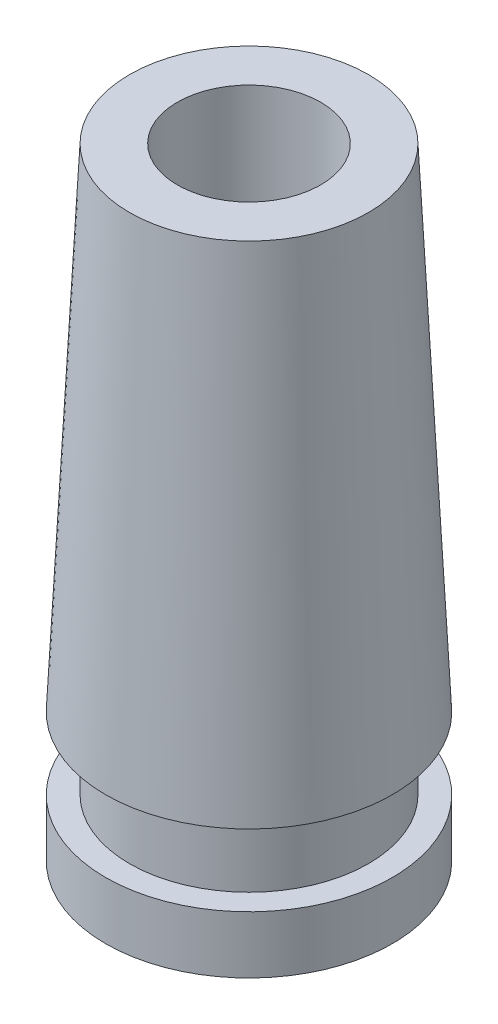
ISO-10303-21;
HEADER;
FILE_DESCRIPTION(('STEP AP214'),'2;1');
FILE_NAME('part.step','',(''),(''),'','','');
FILE_SCHEMA(('AUTOMOTIVE_DESIGN { 1 0 10303 214 1 1 1 1 }'));
ENDSEC;
DATA;
#1=APPLICATION_CONTEXT('core data for automotive mechanical design processes');
#2=APPLICATION_PROTOCOL_DEFINITION('international standard','automotive_design',2000,#1);
#3=PRODUCT_CONTEXT('',#1,'mechanical');
#4=PRODUCT('Part','Part','',(#3));
#5=PRODUCT_RELATED_PRODUCT_CATEGORY('part','',(#4));
#6=PRODUCT_DEFINITION_FORMATION('','',#4);
#7=PRODUCT_DEFINITION_CONTEXT('part definition',#1,'design');
#8=PRODUCT_DEFINITION('design','',#6,#7);
#9=PRODUCT_DEFINITION_SHAPE('','',#8);
#10=(LENGTH_UNIT() NAMED_UNIT(*) SI_UNIT(.MILLI.,.METRE.));
#11=(NAMED_UNIT(*) PLANE_ANGLE_UNIT() SI_UNIT($,.RADIAN.));
#12=(NAMED_UNIT(*) SI_UNIT($,.STERADIAN.) SOLID_ANGLE_UNIT());
#13=UNCERTAINTY_MEASURE_WITH_UNIT(LENGTH_MEASURE(1.E-05),#10,'distance_accuracy_value','');
#14=(GEOMETRIC_REPRESENTATION_CONTEXT(3) GLOBAL_UNCERTAINTY_ASSIGNED_CONTEXT((#13)) GLOBAL_UNIT_ASSIGNED_CONTEXT((#10,
#11,#12)) REPRESENTATION_CONTEXT('',''));
#15=CARTESIAN_POINT('',(0.,0.,0.));
#16=DIRECTION('',(0.,0.,1.));
#17=DIRECTION('',(1.,0.,0.));
#18=AXIS2_PLACEMENT_3D('',#15,#16,#17);
#19=CARTESIAN_POINT('',(0.,0.,0.));
#20=DIRECTION('',(0.,-1.,0.));
#21=DIRECTION('',(0.,0.,-1.));
#22=AXIS2_PLACEMENT_3D('',#19,#20,#21);
#23=CYLINDRICAL_SURFACE('',#22,3.);
#24=CARTESIAN_POINT('',(0.,0.,0.));
#25=DIRECTION('',(0.,-1.,0.));
#26=DIRECTION('',(0.,0.,-1.));
#27=AXIS2_PLACEMENT_3D('',#24,#25,#26);
#28=CIRCLE('',#27,3.);
#29=CARTESIAN_POINT('',(0.,0.,-3.));
#30=VERTEX_POINT('',#29);
#31=EDGE_CURVE('E60',#30,#30,#28,.T.);
#32=ORIENTED_EDGE('',*,*,#31,.F.);
#33=EDGE_LOOP('',(#32));
#34=FACE_BOUND('',#33,.T.);
#35=CARTESIAN_POINT('',(0.,1.2,0.));
#36=DIRECTION('',(0.,-1.,0.));
#37=DIRECTION('',(0.,0.,-1.));
#38=AXIS2_PLACEMENT_3D('',#35,#36,#37);
#39=CIRCLE('',#38,3.);
#40=CARTESIAN_POINT('',(0.,1.2,-3.));
#41=VERTEX_POINT('',#40);
#42=EDGE_CURVE('E10',#41,#41,#39,.T.);
#43=ORIENTED_EDGE('',*,*,#42,.T.);
#44=EDGE_LOOP('',(#43));
#45=FACE_BOUND('',#44,.T.);
#46=ADVANCED_FACE('F32',(#34,#45),#23,.T.);
#47=CARTESIAN_POINT('',(-3.,1.2,0.));
#48=DIRECTION('',(0.,-1.,0.));
#49=DIRECTION('',(0.,0.,-1.));
#50=AXIS2_PLACEMENT_3D('',#47,#48,#49);
#51=PLANE('',#50);
#52=ORIENTED_EDGE('',*,*,#42,.F.);
#53=EDGE_LOOP('',(#52));
#54=FACE_BOUND('',#53,.T.);
#55=CARTESIAN_POINT('',(0.,1.2,0.));
#56=DIRECTION('',(0.,-1.,0.));
#57=DIRECTION('',(0.,0.,-1.));
#58=AXIS2_PLACEMENT_3D('',#55,#56,#57);
#59=CIRCLE('',#58,2.5);
#60=CARTESIAN_POINT('',(0.,1.2,-2.5));
#61=VERTEX_POINT('',#60);
#62=EDGE_CURVE('E38',#61,#61,#59,.T.);
#63=ORIENTED_EDGE('',*,*,#62,.T.);
#64=EDGE_LOOP('',(#63));
#65=FACE_BOUND('',#64,.T.);
#66=ADVANCED_FACE('F67',(#54,#65),#51,.F.);
#67=CARTESIAN_POINT('',(0.,0.,0.));
#68=DIRECTION('',(0.,-1.,0.));
#69=DIRECTION('',(0.,0.,-1.));
#70=AXIS2_PLACEMENT_3D('',#67,#68,#69);
#71=CYLINDRICAL_SURFACE('',#70,2.5);
#72=ORIENTED_EDGE('',*,*,#62,.F.);
#73=EDGE_LOOP('',(#72));
#74=FACE_BOUND('',#73,.T.);
#75=CARTESIAN_POINT('',(0.,2.7,0.));
#76=DIRECTION('',(0.,-1.,0.));
#77=DIRECTION('',(0.,0.,-1.));
#78=AXIS2_PLACEMENT_3D('',#75,#76,#77);
#79=CIRCLE('',#78,2.5);
#80=CARTESIAN_POINT('',(0.,2.7,-2.5));
#81=VERTEX_POINT('',#80);
#82=EDGE_CURVE('E42',#81,#81,#79,.T.);
#83=ORIENTED_EDGE('',*,*,#82,.T.);
#84=EDGE_LOOP('',(#83));
#85=FACE_BOUND('',#84,.T.);
#86=ADVANCED_FACE('F71',(#74,#85),#71,.T.);
#87=CARTESIAN_POINT('',(-2.5,2.7,0.));
#88=DIRECTION('',(0.,1.,0.));
#89=DIRECTION('',(0.,0.,1.));
#90=AXIS2_PLACEMENT_3D('',#87,#88,#89);
#91=PLANE('',#90);
#92=ORIENTED_EDGE('',*,*,#82,.F.);
#93=EDGE_LOOP('',(#92));
#94=FACE_BOUND('',#93,.T.);
#95=CARTESIAN_POINT('',(0.,2.7,0.));
#96=DIRECTION('',(0.,-1.,0.));
#97=DIRECTION('',(0.,0.,-1.));
#98=AXIS2_PLACEMENT_3D('',#95,#96,#97);
#99=CIRCLE('',#98,3.);
#100=CARTESIAN_POINT('',(0.,2.7,-3.));
#101=VERTEX_POINT('',#100);
#102=EDGE_CURVE('E46',#101,#101,#99,.T.);
#103=ORIENTED_EDGE('',*,*,#102,.T.);
#104=EDGE_LOOP('',(#103));
#105=FACE_BOUND('',#104,.T.);
#106=ADVANCED_FACE('F76',(#94,#105),#91,.F.);
#107=CARTESIAN_POINT('',(0.,13.,0.));
#108=DIRECTION('',(0.,-1.,0.));
#109=DIRECTION('',(0.,0.,-1.));
#110=AXIS2_PLACEMENT_3D('',#107,#108,#109);
#111=CONICAL_SURFACE('',#110,2.5,0.0485056122403835);
#112=ORIENTED_EDGE('',*,*,#102,.F.);
#113=EDGE_LOOP('',(#112));
#114=FACE_BOUND('',#113,.T.);
#115=CARTESIAN_POINT('',(0.,13.,0.));
#116=DIRECTION('',(0.,-1.,0.));
#117=DIRECTION('',(0.,0.,-1.));
#118=AXIS2_PLACEMENT_3D('',#115,#116,#117);
#119=CIRCLE('',#118,2.5);
#120=CARTESIAN_POINT('',(0.,13.,-2.5));
#121=VERTEX_POINT('',#120);
#122=EDGE_CURVE('E51',#121,#121,#119,.T.);
#123=ORIENTED_EDGE('',*,*,#122,.T.);
#124=EDGE_LOOP('',(#123));
#125=FACE_BOUND('',#124,.T.);
#126=ADVANCED_FACE('F82',(#114,#125),#111,.T.);
#127=CARTESIAN_POINT('',(-2.5,13.,0.));
#128=DIRECTION('',(0.,-1.,0.));
#129=DIRECTION('',(0.,0.,-1.));
#130=AXIS2_PLACEMENT_3D('',#127,#128,#129);
#131=PLANE('',#130);
#132=ORIENTED_EDGE('',*,*,#122,.F.);
#133=EDGE_LOOP('',(#132));
#134=FACE_BOUND('',#133,.T.);
#135=CARTESIAN_POINT('',(0.,13.,0.));
#136=DIRECTION('',(0.,-1.,0.));
#137=DIRECTION('',(0.,0.,-1.));
#138=AXIS2_PLACEMENT_3D('',#135,#136,#137);
#139=CIRCLE('',#138,1.5);
#140=CARTESIAN_POINT('',(0.,13.,-1.5));
#141=VERTEX_POINT('',#140);
#142=EDGE_CURVE('E54',#141,#141,#139,.T.);
#143=ORIENTED_EDGE('',*,*,#142,.T.);
#144=EDGE_LOOP('',(#143));
#145=FACE_BOUND('',#144,.T.);
#146=ADVANCED_FACE('F86',(#134,#145),#131,.F.);
#147=CARTESIAN_POINT('',(0.,0.,0.));
#148=DIRECTION('',(0.,-1.,0.));
#149=DIRECTION('',(0.,0.,-1.));
#150=AXIS2_PLACEMENT_3D('',#147,#148,#149);
#151=CYLINDRICAL_SURFACE('',#150,1.5);
#152=ORIENTED_EDGE('',*,*,#142,.F.);
#153=EDGE_LOOP('',(#152));
#154=FACE_BOUND('',#153,.T.);
#155=CARTESIAN_POINT('',(0.,0.,0.));
#156=DIRECTION('',(0.,-1.,0.));
#157=DIRECTION('',(0.,0.,-1.));
#158=AXIS2_PLACEMENT_3D('',#155,#156,#157);
#159=CIRCLE('',#158,1.5);
#160=CARTESIAN_POINT('',(0.,0.,-1.5));
#161=VERTEX_POINT('',#160);
#162=EDGE_CURVE('E57',#161,#161,#159,.T.);
#163=ORIENTED_EDGE('',*,*,#162,.T.);
#164=EDGE_LOOP('',(#163));
#165=FACE_BOUND('',#164,.T.);
#166=ADVANCED_FACE('F90',(#154,#165),#151,.F.);
#167=CARTESIAN_POINT('',(-1.5,0.,0.));
#168=DIRECTION('',(0.,1.,0.));
#169=DIRECTION('',(0.,0.,1.));
#170=AXIS2_PLACEMENT_3D('',#167,#168,#169);
#171=PLANE('',#170);
#172=ORIENTED_EDGE('',*,*,#162,.F.);
#173=EDGE_LOOP('',(#172));
#174=FACE_BOUND('',#173,.T.);
#175=ORIENTED_EDGE('',*,*,#31,.T.);
#176=EDGE_LOOP('',(#175));
#177=FACE_BOUND('',#176,.T.);
#178=ADVANCED_FACE('F64',(#174,#177),#171,.F.);
#179=CLOSED_SHELL('',(#46,#66,#86,#106,#126,#146,#166,#178));
#180=MANIFOLD_SOLID_BREP('B2',#179);
#181=ADVANCED_BREP_SHAPE_REPRESENTATION('',(#18,#180),#14);
#182=SHAPE_DEFINITION_REPRESENTATION(#9,#181);
ENDSEC;
END-ISO-10303-21;
